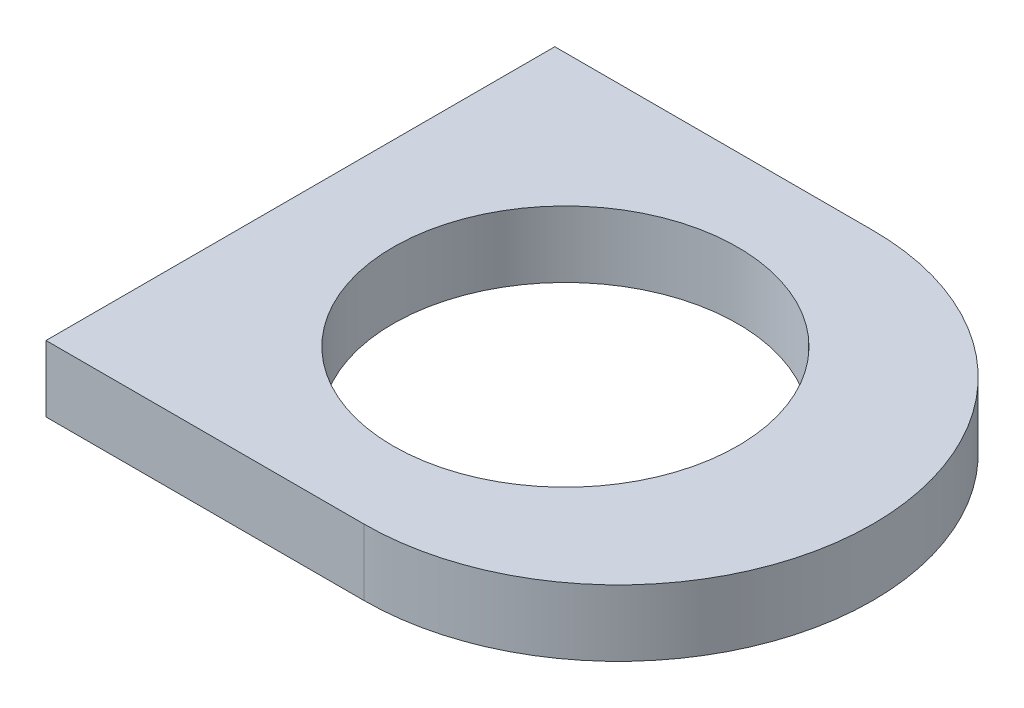
ISO-10303-21;
HEADER;
FILE_DESCRIPTION(('STEP AP214'),'2;1');
FILE_NAME('part.step','',(''),(''),'','','');
FILE_SCHEMA(('AUTOMOTIVE_DESIGN { 1 0 10303 214 1 1 1 1 }'));
ENDSEC;
DATA;
#1=APPLICATION_CONTEXT('core data for automotive mechanical design processes');
#2=APPLICATION_PROTOCOL_DEFINITION('international standard','automotive_design',2000,#1);
#3=PRODUCT_CONTEXT('',#1,'mechanical');
#4=PRODUCT('Part','Part','',(#3));
#5=PRODUCT_RELATED_PRODUCT_CATEGORY('part','',(#4));
#6=PRODUCT_DEFINITION_FORMATION('','',#4);
#7=PRODUCT_DEFINITION_CONTEXT('part definition',#1,'design');
#8=PRODUCT_DEFINITION('design','',#6,#7);
#9=PRODUCT_DEFINITION_SHAPE('','',#8);
#10=(LENGTH_UNIT() NAMED_UNIT(*) SI_UNIT(.MILLI.,.METRE.));
#11=(NAMED_UNIT(*) PLANE_ANGLE_UNIT() SI_UNIT($,.RADIAN.));
#12=(NAMED_UNIT(*) SI_UNIT($,.STERADIAN.) SOLID_ANGLE_UNIT());
#13=UNCERTAINTY_MEASURE_WITH_UNIT(LENGTH_MEASURE(1.E-05),#10,'distance_accuracy_value','');
#14=(GEOMETRIC_REPRESENTATION_CONTEXT(3) GLOBAL_UNCERTAINTY_ASSIGNED_CONTEXT((#13)) GLOBAL_UNIT_ASSIGNED_CONTEXT((#10,
#11,#12)) REPRESENTATION_CONTEXT('',''));
#15=CARTESIAN_POINT('',(0.,0.,0.));
#16=DIRECTION('',(0.,0.,1.));
#17=DIRECTION('',(1.,0.,0.));
#18=AXIS2_PLACEMENT_3D('',#15,#16,#17);
#19=CARTESIAN_POINT('',(0.,12.5,48.));
#20=DIRECTION('',(0.,0.,-1.));
#21=DIRECTION('',(-1.,0.,0.));
#22=AXIS2_PLACEMENT_3D('',#19,#20,#21);
#23=PLANE('',#22);
#24=DIRECTION('',(1.,0.,0.));
#25=VECTOR('',#24,1.);
#26=CARTESIAN_POINT('',(0.,0.,48.));
#27=LINE('',#26,#25);
#28=CARTESIAN_POINT('',(-50.,0.,48.));
#29=VERTEX_POINT('',#28);
#30=CARTESIAN_POINT('',(10.,0.,48.));
#31=VERTEX_POINT('',#30);
#32=EDGE_CURVE('E105',#29,#31,#27,.T.);
#33=ORIENTED_EDGE('',*,*,#32,.T.);
#34=DIRECTION('',(0.,-1.,0.));
#35=VECTOR('',#34,1.);
#36=CARTESIAN_POINT('',(10.,12.5,48.));
#37=LINE('',#36,#35);
#38=CARTESIAN_POINT('',(10.,12.5,48.));
#39=VERTEX_POINT('',#38);
#40=EDGE_CURVE('E11',#39,#31,#37,.T.);
#41=ORIENTED_EDGE('',*,*,#40,.F.);
#42=DIRECTION('',(1.,0.,0.));
#43=VECTOR('',#42,1.);
#44=CARTESIAN_POINT('',(0.,12.5,48.));
#45=LINE('',#44,#43);
#46=CARTESIAN_POINT('',(-50.,12.5,48.));
#47=VERTEX_POINT('',#46);
#48=EDGE_CURVE('E87',#47,#39,#45,.T.);
#49=ORIENTED_EDGE('',*,*,#48,.F.);
#50=DIRECTION('',(0.,-1.,0.));
#51=VECTOR('',#50,1.);
#52=CARTESIAN_POINT('',(-50.,12.5,48.));
#53=LINE('',#52,#51);
#54=EDGE_CURVE('E98',#47,#29,#53,.T.);
#55=ORIENTED_EDGE('',*,*,#54,.T.);
#56=EDGE_LOOP('',(#33,#41,#49,#55));
#57=FACE_BOUND('',#56,.T.);
#58=ADVANCED_FACE('F39',(#57),#23,.F.);
#59=CARTESIAN_POINT('',(10.,12.5,0.));
#60=DIRECTION('',(0.,-1.,0.));
#61=DIRECTION('',(0.,0.,-1.));
#62=AXIS2_PLACEMENT_3D('',#59,#60,#61);
#63=CYLINDRICAL_SURFACE('',#62,48.);
#64=CARTESIAN_POINT('',(10.,0.,0.));
#65=DIRECTION('',(0.,1.,0.));
#66=DIRECTION('',(0.,0.,1.));
#67=AXIS2_PLACEMENT_3D('',#64,#65,#66);
#68=CIRCLE('',#67,48.);
#69=CARTESIAN_POINT('',(10.,0.,-48.));
#70=VERTEX_POINT('',#69);
#71=EDGE_CURVE('E92',#31,#70,#68,.T.);
#72=ORIENTED_EDGE('',*,*,#71,.T.);
#73=DIRECTION('',(0.,-1.,0.));
#74=VECTOR('',#73,1.);
#75=CARTESIAN_POINT('',(10.,12.5,-48.));
#76=LINE('',#75,#74);
#77=CARTESIAN_POINT('',(10.,12.5,-48.));
#78=VERTEX_POINT('',#77);
#79=EDGE_CURVE('E48',#78,#70,#76,.T.);
#80=ORIENTED_EDGE('',*,*,#79,.F.);
#81=CARTESIAN_POINT('',(10.,12.5,0.));
#82=DIRECTION('',(0.,1.,0.));
#83=DIRECTION('',(0.,0.,1.));
#84=AXIS2_PLACEMENT_3D('',#81,#82,#83);
#85=CIRCLE('',#84,48.);
#86=EDGE_CURVE('E82',#39,#78,#85,.T.);
#87=ORIENTED_EDGE('',*,*,#86,.F.);
#88=ORIENTED_EDGE('',*,*,#40,.T.);
#89=EDGE_LOOP('',(#72,#80,#87,#88));
#90=FACE_BOUND('',#89,.T.);
#91=ADVANCED_FACE('F91',(#90),#63,.T.);
#92=CARTESIAN_POINT('',(0.,12.5,-48.));
#93=DIRECTION('',(0.,0.,-1.));
#94=DIRECTION('',(-1.,0.,0.));
#95=AXIS2_PLACEMENT_3D('',#92,#93,#94);
#96=PLANE('',#95);
#97=DIRECTION('',(1.,0.,0.));
#98=VECTOR('',#97,1.);
#99=CARTESIAN_POINT('',(0.,0.,-48.));
#100=LINE('',#99,#98);
#101=CARTESIAN_POINT('',(-50.,0.,-48.));
#102=VERTEX_POINT('',#101);
#103=EDGE_CURVE('E109',#102,#70,#100,.T.);
#104=ORIENTED_EDGE('',*,*,#103,.F.);
#105=DIRECTION('',(0.,-1.,0.));
#106=VECTOR('',#105,1.);
#107=CARTESIAN_POINT('',(-50.,12.5,-48.));
#108=LINE('',#107,#106);
#109=CARTESIAN_POINT('',(-50.,12.5,-48.));
#110=VERTEX_POINT('',#109);
#111=EDGE_CURVE('E72',#110,#102,#108,.T.);
#112=ORIENTED_EDGE('',*,*,#111,.F.);
#113=DIRECTION('',(1.,0.,0.));
#114=VECTOR('',#113,1.);
#115=CARTESIAN_POINT('',(0.,12.5,-48.));
#116=LINE('',#115,#114);
#117=EDGE_CURVE('E85',#110,#78,#116,.T.);
#118=ORIENTED_EDGE('',*,*,#117,.T.);
#119=ORIENTED_EDGE('',*,*,#79,.T.);
#120=EDGE_LOOP('',(#104,#112,#118,#119));
#121=FACE_BOUND('',#120,.T.);
#122=ADVANCED_FACE('F96',(#121),#96,.T.);
#123=CARTESIAN_POINT('',(0.,12.5,0.));
#124=DIRECTION('',(0.,-1.,0.));
#125=DIRECTION('',(0.,0.,-1.));
#126=AXIS2_PLACEMENT_3D('',#123,#124,#125);
#127=CYLINDRICAL_SURFACE('',#126,32.5);
#128=CARTESIAN_POINT('',(0.,12.5,0.));
#129=DIRECTION('',(0.,1.,0.));
#130=DIRECTION('',(0.,0.,1.));
#131=AXIS2_PLACEMENT_3D('',#128,#129,#130);
#132=CIRCLE('',#131,32.5);
#133=CARTESIAN_POINT('',(0.,12.5,32.5));
#134=VERTEX_POINT('',#133);
#135=EDGE_CURVE('E112',#134,#134,#132,.T.);
#136=ORIENTED_EDGE('',*,*,#135,.T.);
#137=EDGE_LOOP('',(#136));
#138=FACE_BOUND('',#137,.T.);
#139=CARTESIAN_POINT('',(0.,0.,0.));
#140=DIRECTION('',(0.,1.,0.));
#141=DIRECTION('',(0.,0.,1.));
#142=AXIS2_PLACEMENT_3D('',#139,#140,#141);
#143=CIRCLE('',#142,32.5);
#144=CARTESIAN_POINT('',(0.,0.,32.5));
#145=VERTEX_POINT('',#144);
#146=EDGE_CURVE('E102',#145,#145,#143,.T.);
#147=ORIENTED_EDGE('',*,*,#146,.F.);
#148=EDGE_LOOP('',(#147));
#149=FACE_BOUND('',#148,.T.);
#150=ADVANCED_FACE('F41',(#138,#149),#127,.F.);
#151=CARTESIAN_POINT('',(-50.,12.5,0.));
#152=DIRECTION('',(1.,0.,0.));
#153=DIRECTION('',(0.,0.,-1.));
#154=AXIS2_PLACEMENT_3D('',#151,#152,#153);
#155=PLANE('',#154);
#156=DIRECTION('',(0.,0.,1.));
#157=VECTOR('',#156,1.);
#158=CARTESIAN_POINT('',(-50.,0.,0.));
#159=LINE('',#158,#157);
#160=EDGE_CURVE('E75',#102,#29,#159,.T.);
#161=ORIENTED_EDGE('',*,*,#160,.T.);
#162=ORIENTED_EDGE('',*,*,#54,.F.);
#163=DIRECTION('',(0.,0.,1.));
#164=VECTOR('',#163,1.);
#165=CARTESIAN_POINT('',(-50.,12.5,0.));
#166=LINE('',#165,#164);
#167=EDGE_CURVE('E56',#110,#47,#166,.T.);
#168=ORIENTED_EDGE('',*,*,#167,.F.);
#169=ORIENTED_EDGE('',*,*,#111,.T.);
#170=EDGE_LOOP('',(#161,#162,#168,#169));
#171=FACE_BOUND('',#170,.T.);
#172=ADVANCED_FACE('F124',(#171),#155,.F.);
#173=CARTESIAN_POINT('',(0.,12.5,0.));
#174=DIRECTION('',(0.,1.,0.));
#175=DIRECTION('',(0.,0.,1.));
#176=AXIS2_PLACEMENT_3D('',#173,#174,#175);
#177=PLANE('',#176);
#178=ORIENTED_EDGE('',*,*,#135,.F.);
#179=EDGE_LOOP('',(#178));
#180=FACE_BOUND('',#179,.T.);
#181=ORIENTED_EDGE('',*,*,#48,.T.);
#182=ORIENTED_EDGE('',*,*,#86,.T.);
#183=ORIENTED_EDGE('',*,*,#117,.F.);
#184=ORIENTED_EDGE('',*,*,#167,.T.);
#185=EDGE_LOOP('',(#181,#182,#183,#184));
#186=FACE_BOUND('',#185,.T.);
#187=ADVANCED_FACE('F83',(#180,#186),#177,.T.);
#188=CARTESIAN_POINT('',(0.,0.,0.));
#189=DIRECTION('',(0.,1.,0.));
#190=DIRECTION('',(0.,0.,1.));
#191=AXIS2_PLACEMENT_3D('',#188,#189,#190);
#192=PLANE('',#191);
#193=ORIENTED_EDGE('',*,*,#146,.T.);
#194=EDGE_LOOP('',(#193));
#195=FACE_BOUND('',#194,.T.);
#196=ORIENTED_EDGE('',*,*,#32,.F.);
#197=ORIENTED_EDGE('',*,*,#160,.F.);
#198=ORIENTED_EDGE('',*,*,#103,.T.);
#199=ORIENTED_EDGE('',*,*,#71,.F.);
#200=EDGE_LOOP('',(#196,#197,#198,#199));
#201=FACE_BOUND('',#200,.T.);
#202=ADVANCED_FACE('F117',(#195,#201),#192,.F.);
#203=CLOSED_SHELL('',(#58,#91,#122,#150,#172,#187,#202));
#204=MANIFOLD_SOLID_BREP('B2',#203);
#205=ADVANCED_BREP_SHAPE_REPRESENTATION('',(#18,#204),#14);
#206=SHAPE_DEFINITION_REPRESENTATION(#9,#205);
ENDSEC;
END-ISO-10303-21;
